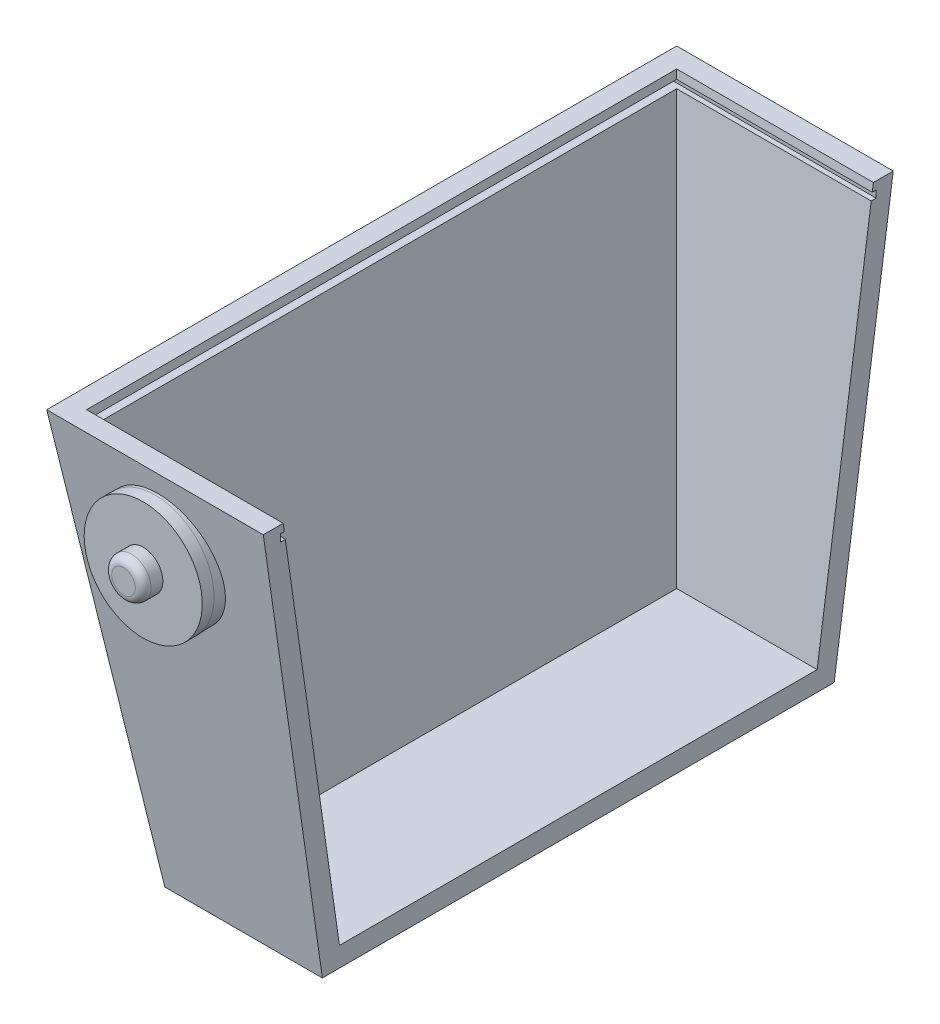
ISO-10303-21;
HEADER;
FILE_DESCRIPTION(('STEP AP214'),'2;1');
FILE_NAME('part.step','',(''),(''),'','','');
FILE_SCHEMA(('AUTOMOTIVE_DESIGN { 1 0 10303 214 1 1 1 1 }'));
ENDSEC;
DATA;
#1=APPLICATION_CONTEXT('core data for automotive mechanical design processes');
#2=APPLICATION_PROTOCOL_DEFINITION('international standard','automotive_design',2000,#1);
#3=PRODUCT_CONTEXT('',#1,'mechanical');
#4=PRODUCT('Part','Part','',(#3));
#5=PRODUCT_RELATED_PRODUCT_CATEGORY('part','',(#4));
#6=PRODUCT_DEFINITION_FORMATION('','',#4);
#7=PRODUCT_DEFINITION_CONTEXT('part definition',#1,'design');
#8=PRODUCT_DEFINITION('design','',#6,#7);
#9=PRODUCT_DEFINITION_SHAPE('','',#8);
#10=(LENGTH_UNIT() NAMED_UNIT(*) SI_UNIT(.MILLI.,.METRE.));
#11=(NAMED_UNIT(*) PLANE_ANGLE_UNIT() SI_UNIT($,.RADIAN.));
#12=(NAMED_UNIT(*) SI_UNIT($,.STERADIAN.) SOLID_ANGLE_UNIT());
#13=UNCERTAINTY_MEASURE_WITH_UNIT(LENGTH_MEASURE(1.E-05),#10,'distance_accuracy_value','');
#14=(GEOMETRIC_REPRESENTATION_CONTEXT(3) GLOBAL_UNCERTAINTY_ASSIGNED_CONTEXT((#13)) GLOBAL_UNIT_ASSIGNED_CONTEXT((#10,
#11,#12)) REPRESENTATION_CONTEXT('',''));
#15=CARTESIAN_POINT('',(0.,0.,0.));
#16=DIRECTION('',(0.,0.,1.));
#17=DIRECTION('',(1.,0.,0.));
#18=AXIS2_PLACEMENT_3D('',#15,#16,#17);
#19=CARTESIAN_POINT('',(0.,0.,0.));
#20=DIRECTION('',(-1.,0.,0.));
#21=DIRECTION('',(0.,0.,1.));
#22=AXIS2_PLACEMENT_3D('',#19,#20,#21);
#23=PLANE('',#22);
#24=DIRECTION('',(0.,0.,-1.));
#25=VECTOR('',#24,1.);
#26=CARTESIAN_POINT('',(0.,261.62,27.0853483984726));
#27=LINE('',#26,#25);
#28=CARTESIAN_POINT('',(0.,261.62,-354.745348398473));
#29=VERTEX_POINT('',#28);
#30=CARTESIAN_POINT('',(0.,261.62,-357.285348398473));
#31=VERTEX_POINT('',#30);
#32=EDGE_CURVE('E188',#29,#31,#27,.T.);
#33=ORIENTED_EDGE('',*,*,#32,.T.);
#34=DIRECTION('',(0.,-1.,0.));
#35=VECTOR('',#34,1.);
#36=CARTESIAN_POINT('',(0.,261.62,-357.285348398473));
#37=LINE('',#36,#35);
#38=CARTESIAN_POINT('',(0.,257.048,-357.285348398473));
#39=VERTEX_POINT('',#38);
#40=EDGE_CURVE('E208',#31,#39,#37,.T.);
#41=ORIENTED_EDGE('',*,*,#40,.T.);
#42=DIRECTION('',(0.,0.,1.));
#43=VECTOR('',#42,1.);
#44=CARTESIAN_POINT('',(0.,257.048,-357.285348398473));
#45=LINE('',#44,#43);
#46=CARTESIAN_POINT('',(0.,257.048,-354.09220554133));
#47=VERTEX_POINT('',#46);
#48=EDGE_CURVE('E213',#39,#47,#45,.T.);
#49=ORIENTED_EDGE('',*,*,#48,.T.);
#50=DIRECTION('',(0.,-0.989949493661166,0.141421356237309));
#51=VECTOR('',#50,1.);
#52=CARTESIAN_POINT('',(0.,12.7,-319.185348398473));
#53=LINE('',#52,#51);
#54=CARTESIAN_POINT('',(0.,12.7,-319.185348398473));
#55=VERTEX_POINT('',#54);
#56=EDGE_CURVE('E348',#47,#55,#53,.T.);
#57=ORIENTED_EDGE('',*,*,#56,.T.);
#58=DIRECTION('',(0.,0.,1.));
#59=VECTOR('',#58,1.);
#60=CARTESIAN_POINT('',(0.,12.7,-11.0146516015273));
#61=LINE('',#60,#59);
#62=CARTESIAN_POINT('',(0.,12.7,-11.0146516015273));
#63=VERTEX_POINT('',#62);
#64=EDGE_CURVE('E254',#55,#63,#61,.T.);
#65=ORIENTED_EDGE('',*,*,#64,.T.);
#66=DIRECTION('',(0.,0.989949493661166,0.141421356237309));
#67=VECTOR('',#66,1.);
#68=CARTESIAN_POINT('',(0.,266.7,25.2710626841869));
#69=LINE('',#68,#67);
#70=CARTESIAN_POINT('',(0.,257.048,23.8922055413297));
#71=VERTEX_POINT('',#70);
#72=EDGE_CURVE('E346',#63,#71,#69,.T.);
#73=ORIENTED_EDGE('',*,*,#72,.T.);
#74=CARTESIAN_POINT('',(0.,257.048,27.0853483984727));
#75=VERTEX_POINT('',#74);
#76=EDGE_CURVE('E211',#71,#75,#45,.T.);
#77=ORIENTED_EDGE('',*,*,#76,.T.);
#78=DIRECTION('',(0.,1.,0.));
#79=VECTOR('',#78,1.);
#80=CARTESIAN_POINT('',(0.,257.048,27.0853483984727));
#81=LINE('',#80,#79);
#82=CARTESIAN_POINT('',(0.,261.62,27.0853483984726));
#83=VERTEX_POINT('',#82);
#84=EDGE_CURVE('E186',#75,#83,#81,.T.);
#85=ORIENTED_EDGE('',*,*,#84,.T.);
#86=CARTESIAN_POINT('',(0.,261.62,24.5453483984727));
#87=VERTEX_POINT('',#86);
#88=EDGE_CURVE('E212',#83,#87,#27,.T.);
#89=ORIENTED_EDGE('',*,*,#88,.T.);
#90=CARTESIAN_POINT('',(0.,266.7,25.2710626841869));
#91=VERTEX_POINT('',#90);
#92=EDGE_CURVE('E64',#87,#91,#69,.T.);
#93=ORIENTED_EDGE('',*,*,#92,.T.);
#94=DIRECTION('',(0.,0.,-1.));
#95=VECTOR('',#94,1.);
#96=CARTESIAN_POINT('',(0.,266.7,-368.3));
#97=LINE('',#96,#95);
#98=CARTESIAN_POINT('',(0.,266.7,38.1));
#99=VERTEX_POINT('',#98);
#100=EDGE_CURVE('E326',#99,#91,#97,.T.);
#101=ORIENTED_EDGE('',*,*,#100,.F.);
#102=DIRECTION('',(0.,0.989949493661166,0.141421356237309));
#103=VECTOR('',#102,1.);
#104=CARTESIAN_POINT('',(0.,0.,0.));
#105=LINE('',#104,#103);
#106=CARTESIAN_POINT('',(0.,0.,0.));
#107=VERTEX_POINT('',#106);
#108=EDGE_CURVE('E497',#107,#99,#105,.T.);
#109=ORIENTED_EDGE('',*,*,#108,.F.);
#110=DIRECTION('',(0.,0.,-1.));
#111=VECTOR('',#110,1.);
#112=CARTESIAN_POINT('',(0.,0.,-330.2));
#113=LINE('',#112,#111);
#114=CARTESIAN_POINT('',(0.,0.,-330.2));
#115=VERTEX_POINT('',#114);
#116=EDGE_CURVE('E479',#107,#115,#113,.T.);
#117=ORIENTED_EDGE('',*,*,#116,.T.);
#118=DIRECTION('',(0.,0.989949493661167,-0.141421356237309));
#119=VECTOR('',#118,1.);
#120=CARTESIAN_POINT('',(0.,0.,-330.2));
#121=LINE('',#120,#119);
#122=CARTESIAN_POINT('',(0.,266.7,-368.3));
#123=VERTEX_POINT('',#122);
#124=EDGE_CURVE('E488',#115,#123,#121,.T.);
#125=ORIENTED_EDGE('',*,*,#124,.T.);
#126=CARTESIAN_POINT('',(0.,266.7,-355.471062684187));
#127=VERTEX_POINT('',#126);
#128=EDGE_CURVE('E343',#127,#123,#97,.T.);
#129=ORIENTED_EDGE('',*,*,#128,.F.);
#130=EDGE_CURVE('E263',#127,#29,#53,.T.);
#131=ORIENTED_EDGE('',*,*,#130,.T.);
#132=EDGE_LOOP('',(#33,#41,#49,#57,#65,#73,#77,#85,#89,#93,#101,#109,#117,#125,#129,#131));
#133=FACE_BOUND('',#132,.T.);
#134=ADVANCED_FACE('F60',(#133),#23,.F.);
#135=CARTESIAN_POINT('',(0.,1.79605122421383,-12.5723585694968));
#136=DIRECTION('',(0.,0.14142135623731,-0.989949493661167));
#137=DIRECTION('',(0.,0.989949493661167,0.14142135623731));
#138=AXIS2_PLACEMENT_3D('',#135,#136,#137);
#139=PLANE('',#138);
#140=ORIENTED_EDGE('',*,*,#92,.F.);
#141=DIRECTION('',(-1.,0.,0.));
#142=VECTOR('',#141,1.);
#143=CARTESIAN_POINT('',(0.,261.62,24.5453483984726));
#144=LINE('',#143,#142);
#145=CARTESIAN_POINT('',(-126.145348398473,261.62,24.5453483984726));
#146=VERTEX_POINT('',#145);
#147=EDGE_CURVE('E230',#87,#146,#144,.T.);
#148=ORIENTED_EDGE('',*,*,#147,.T.);
#149=DIRECTION('',(-0.140028008402802,0.980196058819607,0.140028008402801));
#150=VECTOR('',#149,1.);
#151=CARTESIAN_POINT('',(-87.2820014024541,-10.4234289721298,-14.3179985975459));
#152=LINE('',#151,#150);
#153=CARTESIAN_POINT('',(-126.871062684187,266.7,25.2710626841869));
#154=VERTEX_POINT('',#153);
#155=EDGE_CURVE('E272',#146,#154,#152,.T.);
#156=ORIENTED_EDGE('',*,*,#155,.T.);
#157=DIRECTION('',(1.,0.,0.));
#158=VECTOR('',#157,1.);
#159=CARTESIAN_POINT('',(0.,266.7,25.2710626841869));
#160=LINE('',#159,#158);
#161=EDGE_CURVE('E371',#154,#91,#160,.T.);
#162=ORIENTED_EDGE('',*,*,#161,.T.);
#163=EDGE_LOOP('',(#140,#148,#156,#162));
#164=FACE_BOUND('',#163,.T.);
#165=ADVANCED_FACE('F409',(#164),#139,.T.);
#166=CARTESIAN_POINT('',(-90.5853483984726,12.7,-11.0146516015274));
#167=VERTEX_POINT('',#166);
#168=CARTESIAN_POINT('',(-125.49220554133,257.048,23.8922055413298));
#169=VERTEX_POINT('',#168);
#170=EDGE_CURVE('E268',#167,#169,#152,.T.);
#171=ORIENTED_EDGE('',*,*,#170,.T.);
#172=DIRECTION('',(1.,0.,0.));
#173=VECTOR('',#172,1.);
#174=CARTESIAN_POINT('',(0.,257.048,23.8922055413298));
#175=LINE('',#174,#173);
#176=EDGE_CURVE('E78',#169,#71,#175,.T.);
#177=ORIENTED_EDGE('',*,*,#176,.T.);
#178=ORIENTED_EDGE('',*,*,#72,.F.);
#179=DIRECTION('',(1.,0.,0.));
#180=VECTOR('',#179,1.);
#181=CARTESIAN_POINT('',(0.,12.7,-11.0146516015274));
#182=LINE('',#181,#180);
#183=EDGE_CURVE('E265',#167,#63,#182,.T.);
#184=ORIENTED_EDGE('',*,*,#183,.F.);
#185=EDGE_LOOP('',(#171,#177,#178,#184));
#186=FACE_BOUND('',#185,.T.);
#187=ADVANCED_FACE('F412',(#186),#139,.T.);
#188=CARTESIAN_POINT('',(0.,-44.4319487757861,-311.023641430503));
#189=DIRECTION('',(0.,0.141421356237309,0.989949493661166));
#190=DIRECTION('',(0.,-0.989949493661167,0.141421356237309));
#191=AXIS2_PLACEMENT_3D('',#188,#189,#190);
#192=PLANE('',#191);
#193=DIRECTION('',(-0.140028008402802,0.980196058819607,-0.140028008402801));
#194=VECTOR('',#193,1.);
#195=CARTESIAN_POINT('',(-80.8074915985325,-55.7449975995807,-309.407491598532));
#196=LINE('',#195,#194);
#197=CARTESIAN_POINT('',(-126.145348398473,261.62,-354.745348398473));
#198=VERTEX_POINT('',#197);
#199=CARTESIAN_POINT('',(-126.871062684187,266.7,-355.471062684187));
#200=VERTEX_POINT('',#199);
#201=EDGE_CURVE('E267',#198,#200,#196,.T.);
#202=ORIENTED_EDGE('',*,*,#201,.F.);
#203=DIRECTION('',(1.,0.,0.));
#204=VECTOR('',#203,1.);
#205=CARTESIAN_POINT('',(0.,261.62,-354.745348398473));
#206=LINE('',#205,#204);
#207=EDGE_CURVE('E227',#198,#29,#206,.T.);
#208=ORIENTED_EDGE('',*,*,#207,.T.);
#209=ORIENTED_EDGE('',*,*,#130,.F.);
#210=DIRECTION('',(-1.,0.,0.));
#211=VECTOR('',#210,1.);
#212=CARTESIAN_POINT('',(0.,266.7,-355.471062684187));
#213=LINE('',#212,#211);
#214=EDGE_CURVE('E278',#127,#200,#213,.T.);
#215=ORIENTED_EDGE('',*,*,#214,.T.);
#216=EDGE_LOOP('',(#202,#208,#209,#215));
#217=FACE_BOUND('',#216,.T.);
#218=ADVANCED_FACE('F398',(#217),#192,.T.);
#219=ORIENTED_EDGE('',*,*,#56,.F.);
#220=DIRECTION('',(-1.,0.,0.));
#221=VECTOR('',#220,1.);
#222=CARTESIAN_POINT('',(0.,257.048,-354.09220554133));
#223=LINE('',#222,#221);
#224=CARTESIAN_POINT('',(-125.49220554133,257.048,-354.09220554133));
#225=VERTEX_POINT('',#224);
#226=EDGE_CURVE('E217',#47,#225,#223,.T.);
#227=ORIENTED_EDGE('',*,*,#226,.T.);
#228=CARTESIAN_POINT('',(-90.5853483984726,12.7,-319.185348398473));
#229=VERTEX_POINT('',#228);
#230=EDGE_CURVE('E273',#229,#225,#196,.T.);
#231=ORIENTED_EDGE('',*,*,#230,.F.);
#232=DIRECTION('',(-1.,0.,0.));
#233=VECTOR('',#232,1.);
#234=CARTESIAN_POINT('',(0.,12.7,-319.185348398473));
#235=LINE('',#234,#233);
#236=EDGE_CURVE('E262',#55,#229,#235,.T.);
#237=ORIENTED_EDGE('',*,*,#236,.F.);
#238=EDGE_LOOP('',(#219,#227,#231,#237));
#239=FACE_BOUND('',#238,.T.);
#240=ADVANCED_FACE('F419',(#239),#192,.T.);
#241=CARTESIAN_POINT('',(-86.9956414305031,-12.4279487757862,0.));
#242=DIRECTION('',(0.989949493661166,0.14142135623731,0.));
#243=DIRECTION('',(-0.14142135623731,0.989949493661166,0.));
#244=AXIS2_PLACEMENT_3D('',#241,#242,#243);
#245=PLANE('',#244);
#246=ORIENTED_EDGE('',*,*,#155,.F.);
#247=DIRECTION('',(0.,0.,-1.));
#248=VECTOR('',#247,1.);
#249=CARTESIAN_POINT('',(-126.145348398473,261.62,0.));
#250=LINE('',#249,#248);
#251=EDGE_CURVE('E14',#146,#198,#250,.T.);
#252=ORIENTED_EDGE('',*,*,#251,.T.);
#253=ORIENTED_EDGE('',*,*,#201,.T.);
#254=DIRECTION('',(0.,0.,1.));
#255=VECTOR('',#254,1.);
#256=CARTESIAN_POINT('',(-126.871062684187,266.7,0.));
#257=LINE('',#256,#255);
#258=EDGE_CURVE('E271',#200,#154,#257,.T.);
#259=ORIENTED_EDGE('',*,*,#258,.T.);
#260=EDGE_LOOP('',(#246,#252,#253,#259));
#261=FACE_BOUND('',#260,.T.);
#262=ADVANCED_FACE('F405',(#261),#245,.T.);
#263=ORIENTED_EDGE('',*,*,#230,.T.);
#264=DIRECTION('',(0.,0.,1.));
#265=VECTOR('',#264,1.);
#266=CARTESIAN_POINT('',(-125.49220554133,257.048,0.));
#267=LINE('',#266,#265);
#268=EDGE_CURVE('E70',#225,#169,#267,.T.);
#269=ORIENTED_EDGE('',*,*,#268,.T.);
#270=ORIENTED_EDGE('',*,*,#170,.F.);
#271=DIRECTION('',(0.,0.,1.));
#272=VECTOR('',#271,1.);
#273=CARTESIAN_POINT('',(-90.5853483984726,12.7,0.));
#274=LINE('',#273,#272);
#275=EDGE_CURVE('E259',#229,#167,#274,.T.);
#276=ORIENTED_EDGE('',*,*,#275,.F.);
#277=EDGE_LOOP('',(#263,#269,#270,#276));
#278=FACE_BOUND('',#277,.T.);
#279=ADVANCED_FACE('F416',(#278),#245,.T.);
#280=CARTESIAN_POINT('',(0.,266.7,0.));
#281=DIRECTION('',(0.,-1.,0.));
#282=DIRECTION('',(0.,0.,-1.));
#283=AXIS2_PLACEMENT_3D('',#280,#281,#282);
#284=PLANE('',#283);
#285=ORIENTED_EDGE('',*,*,#214,.F.);
#286=ORIENTED_EDGE('',*,*,#128,.T.);
#287=DIRECTION('',(-1.,0.,0.));
#288=VECTOR('',#287,1.);
#289=CARTESIAN_POINT('',(-139.7,266.7,-368.3));
#290=LINE('',#289,#288);
#291=CARTESIAN_POINT('',(-139.7,266.7,-368.3));
#292=VERTEX_POINT('',#291);
#293=EDGE_CURVE('E86',#123,#292,#290,.T.);
#294=ORIENTED_EDGE('',*,*,#293,.T.);
#295=DIRECTION('',(0.,0.,1.));
#296=VECTOR('',#295,1.);
#297=CARTESIAN_POINT('',(-139.7,266.7,38.1));
#298=LINE('',#297,#296);
#299=CARTESIAN_POINT('',(-139.7,266.7,38.1));
#300=VERTEX_POINT('',#299);
#301=EDGE_CURVE('E495',#292,#300,#298,.T.);
#302=ORIENTED_EDGE('',*,*,#301,.T.);
#303=DIRECTION('',(1.,0.,0.));
#304=VECTOR('',#303,1.);
#305=CARTESIAN_POINT('',(-139.7,266.7,38.1));
#306=LINE('',#305,#304);
#307=EDGE_CURVE('E354',#300,#99,#306,.T.);
#308=ORIENTED_EDGE('',*,*,#307,.T.);
#309=ORIENTED_EDGE('',*,*,#100,.T.);
#310=ORIENTED_EDGE('',*,*,#161,.F.);
#311=ORIENTED_EDGE('',*,*,#258,.F.);
#312=EDGE_LOOP('',(#285,#286,#294,#302,#308,#309,#310,#311));
#313=FACE_BOUND('',#312,.T.);
#314=ADVANCED_FACE('F449',(#313),#284,.F.);
#315=CARTESIAN_POINT('',(0.,0.,0.));
#316=DIRECTION('',(0.,1.,0.));
#317=DIRECTION('',(0.,0.,1.));
#318=AXIS2_PLACEMENT_3D('',#315,#316,#317);
#319=PLANE('',#318);
#320=DIRECTION('',(0.,0.,1.));
#321=VECTOR('',#320,1.);
#322=CARTESIAN_POINT('',(-101.6,0.,0.));
#323=LINE('',#322,#321);
#324=CARTESIAN_POINT('',(-101.6,0.,-330.2));
#325=VERTEX_POINT('',#324);
#326=CARTESIAN_POINT('',(-101.6,0.,0.));
#327=VERTEX_POINT('',#326);
#328=EDGE_CURVE('E376',#325,#327,#323,.T.);
#329=ORIENTED_EDGE('',*,*,#328,.F.);
#330=DIRECTION('',(-1.,0.,0.));
#331=VECTOR('',#330,1.);
#332=CARTESIAN_POINT('',(0.,0.,-330.2));
#333=LINE('',#332,#331);
#334=EDGE_CURVE('E472',#115,#325,#333,.T.);
#335=ORIENTED_EDGE('',*,*,#334,.F.);
#336=ORIENTED_EDGE('',*,*,#116,.F.);
#337=DIRECTION('',(1.,0.,0.));
#338=VECTOR('',#337,1.);
#339=CARTESIAN_POINT('',(0.,0.,0.));
#340=LINE('',#339,#338);
#341=EDGE_CURVE('E284',#327,#107,#340,.T.);
#342=ORIENTED_EDGE('',*,*,#341,.F.);
#343=EDGE_LOOP('',(#329,#335,#336,#342));
#344=FACE_BOUND('',#343,.T.);
#345=ADVANCED_FACE('F303',(#344),#319,.F.);
#346=CARTESIAN_POINT('',(0.,0.,0.));
#347=DIRECTION('',(0.,0.14142135623731,-0.989949493661167));
#348=DIRECTION('',(0.,0.989949493661167,0.14142135623731));
#349=AXIS2_PLACEMENT_3D('',#346,#347,#348);
#350=PLANE('',#349);
#351=CARTESIAN_POINT('',(-69.8500000000001,216.088809201909,30.869829885987));
#352=DIRECTION('',(0.,0.14142135623731,-0.989949493661167));
#353=DIRECTION('',(0.,0.989949493661167,0.14142135623731));
#354=AXIS2_PLACEMENT_3D('',#351,#352,#353);
#355=ELLIPSE('',#354,38.2317654975403,37.8470459386596);
#356=CARTESIAN_POINT('',(-69.8500000000002,253.936326097971,36.2766180139959));
#357=VERTEX_POINT('',#356);
#358=EDGE_CURVE('E379',#357,#357,#355,.F.);
#359=ORIENTED_EDGE('',*,*,#358,.F.);
#360=EDGE_LOOP('',(#359));
#361=FACE_BOUND('',#360,.T.);
#362=ORIENTED_EDGE('',*,*,#108,.T.);
#363=ORIENTED_EDGE('',*,*,#307,.F.);
#364=DIRECTION('',(-0.140028008402802,0.980196058819607,0.140028008402801));
#365=VECTOR('',#364,1.);
#366=CARTESIAN_POINT('',(-101.6,0.,0.));
#367=LINE('',#366,#365);
#368=EDGE_CURVE('E290',#327,#300,#367,.T.);
#369=ORIENTED_EDGE('',*,*,#368,.F.);
#370=ORIENTED_EDGE('',*,*,#341,.T.);
#371=EDGE_LOOP('',(#362,#363,#369,#370));
#372=FACE_BOUND('',#371,.T.);
#373=ADVANCED_FACE('F292',(#361,#372),#350,.F.);
#374=CARTESIAN_POINT('',(0.,-46.228,-323.596));
#375=DIRECTION('',(0.,0.141421356237309,0.989949493661166));
#376=DIRECTION('',(0.,-0.989949493661167,0.141421356237309));
#377=AXIS2_PLACEMENT_3D('',#374,#375,#376);
#378=PLANE('',#377);
#379=CARTESIAN_POINT('',(-69.8500000000001,216.088809201909,-361.069829885987));
#380=DIRECTION('',(0.,0.141421356237309,0.989949493661166));
#381=DIRECTION('',(0.,0.989949493661166,-0.141421356237309));
#382=AXIS2_PLACEMENT_3D('',#379,#380,#381);
#383=ELLIPSE('',#382,38.2317654975403,37.8470459386595);
#384=CARTESIAN_POINT('',(-69.8500000000001,253.936326097971,-366.476618013996));
#385=VERTEX_POINT('',#384);
#386=EDGE_CURVE('E244',#385,#385,#383,.T.);
#387=ORIENTED_EDGE('',*,*,#386,.T.);
#388=EDGE_LOOP('',(#387));
#389=FACE_BOUND('',#388,.T.);
#390=DIRECTION('',(-0.140028008402802,0.980196058819607,-0.140028008402801));
#391=VECTOR('',#390,1.);
#392=CARTESIAN_POINT('',(-101.6,0.,-330.2));
#393=LINE('',#392,#391);
#394=EDGE_CURVE('E493',#325,#292,#393,.T.);
#395=ORIENTED_EDGE('',*,*,#394,.T.);
#396=ORIENTED_EDGE('',*,*,#293,.F.);
#397=ORIENTED_EDGE('',*,*,#124,.F.);
#398=ORIENTED_EDGE('',*,*,#334,.T.);
#399=EDGE_LOOP('',(#395,#396,#397,#398));
#400=FACE_BOUND('',#399,.T.);
#401=ADVANCED_FACE('F302',(#389,#400),#378,.F.);
#402=CARTESIAN_POINT('',(-99.568,-14.2240000000001,0.));
#403=DIRECTION('',(0.989949493661166,0.14142135623731,0.));
#404=DIRECTION('',(-0.14142135623731,0.989949493661166,0.));
#405=AXIS2_PLACEMENT_3D('',#402,#403,#404);
#406=PLANE('',#405);
#407=ORIENTED_EDGE('',*,*,#368,.T.);
#408=ORIENTED_EDGE('',*,*,#301,.F.);
#409=ORIENTED_EDGE('',*,*,#394,.F.);
#410=ORIENTED_EDGE('',*,*,#328,.T.);
#411=EDGE_LOOP('',(#407,#408,#409,#410));
#412=FACE_BOUND('',#411,.T.);
#413=ADVANCED_FACE('F425',(#412),#406,.F.);
#414=CARTESIAN_POINT('',(0.,12.7,0.));
#415=DIRECTION('',(0.,1.,0.));
#416=DIRECTION('',(0.,0.,1.));
#417=AXIS2_PLACEMENT_3D('',#414,#415,#416);
#418=PLANE('',#417);
#419=ORIENTED_EDGE('',*,*,#275,.T.);
#420=ORIENTED_EDGE('',*,*,#183,.T.);
#421=ORIENTED_EDGE('',*,*,#64,.F.);
#422=ORIENTED_EDGE('',*,*,#236,.T.);
#423=EDGE_LOOP('',(#419,#420,#421,#422));
#424=FACE_BOUND('',#423,.T.);
#425=ADVANCED_FACE('F422',(#424),#418,.T.);
#426=CARTESIAN_POINT('',(-69.8500000000001,215.9,45.7200000000001));
#427=DIRECTION('',(0.,0.,-1.));
#428=DIRECTION('',(-1.,0.,0.));
#429=AXIS2_PLACEMENT_3D('',#426,#427,#428);
#430=CYLINDRICAL_SURFACE('',#429,38.1);
#431=CARTESIAN_POINT('',(-69.8500000000001,215.9,45.7200000000001));
#432=DIRECTION('',(0.,0.,-1.));
#433=DIRECTION('',(-1.,0.,0.));
#434=AXIS2_PLACEMENT_3D('',#431,#432,#433);
#435=CIRCLE('',#434,38.1);
#436=CARTESIAN_POINT('',(-107.95,215.9,45.7200000000001));
#437=VERTEX_POINT('',#436);
#438=EDGE_CURVE('E251',#437,#437,#435,.T.);
#439=ORIENTED_EDGE('',*,*,#438,.T.);
#440=EDGE_LOOP('',(#439));
#441=FACE_BOUND('',#440,.T.);
#442=CARTESIAN_POINT('',(-69.8500000000001,215.9,38.1000000000001));
#443=DIRECTION('',(0.,0.,-1.));
#444=DIRECTION('',(-1.,0.,0.));
#445=AXIS2_PLACEMENT_3D('',#442,#443,#444);
#446=CIRCLE('',#445,38.1);
#447=CARTESIAN_POINT('',(-107.95,215.9,38.1000000000001));
#448=VERTEX_POINT('',#447);
#449=EDGE_CURVE('E250',#448,#448,#446,.T.);
#450=ORIENTED_EDGE('',*,*,#449,.F.);
#451=EDGE_LOOP('',(#450));
#452=FACE_BOUND('',#451,.T.);
#453=ADVANCED_FACE('F424',(#441,#452),#430,.T.);
#454=CARTESIAN_POINT('',(-69.8500000000001,215.9,45.7200000000001));
#455=DIRECTION('',(0.,0.,-1.));
#456=DIRECTION('',(-1.,0.,0.));
#457=AXIS2_PLACEMENT_3D('',#454,#455,#456);
#458=PLANE('',#457);
#459=CARTESIAN_POINT('',(-69.8500000000001,215.9,45.7200000000003));
#460=DIRECTION('',(0.,0.,-1.));
#461=DIRECTION('',(-1.,0.,0.));
#462=AXIS2_PLACEMENT_3D('',#459,#460,#461);
#463=CIRCLE('',#462,12.7);
#464=CARTESIAN_POINT('',(-82.5500000000001,215.9,45.7200000000003));
#465=VERTEX_POINT('',#464);
#466=EDGE_CURVE('E247',#465,#465,#463,.T.);
#467=ORIENTED_EDGE('',*,*,#466,.T.);
#468=EDGE_LOOP('',(#467));
#469=FACE_BOUND('',#468,.T.);
#470=ORIENTED_EDGE('',*,*,#438,.F.);
#471=EDGE_LOOP('',(#470));
#472=FACE_BOUND('',#471,.T.);
#473=ADVANCED_FACE('F431',(#469,#472),#458,.F.);
#474=CARTESIAN_POINT('',(-69.8500000000001,215.9,38.1000000000001));
#475=DIRECTION('',(0.,0.,1.));
#476=DIRECTION('',(-1.,0.,0.));
#477=AXIS2_PLACEMENT_3D('',#474,#475,#476);
#478=CONICAL_SURFACE('',#477,38.1,0.0349065850398866);
#479=ORIENTED_EDGE('',*,*,#449,.T.);
#480=EDGE_LOOP('',(#479));
#481=FACE_BOUND('',#480,.T.);
#482=ORIENTED_EDGE('',*,*,#358,.T.);
#483=EDGE_LOOP('',(#482));
#484=FACE_BOUND('',#483,.T.);
#485=ADVANCED_FACE('F576',(#481,#484),#478,.T.);
#486=CARTESIAN_POINT('',(-69.8500000000001,215.9,58.4200000000003));
#487=DIRECTION('',(0.,0.,-1.));
#488=DIRECTION('',(-1.,0.,0.));
#489=AXIS2_PLACEMENT_3D('',#486,#487,#488);
#490=CYLINDRICAL_SURFACE('',#489,12.7);
#491=CARTESIAN_POINT('',(-69.8500000000001,215.9,53.3400000000003));
#492=DIRECTION('',(0.,0.,-1.));
#493=DIRECTION('',(-1.,0.,0.));
#494=AXIS2_PLACEMENT_3D('',#491,#492,#493);
#495=CIRCLE('',#494,12.7);
#496=CARTESIAN_POINT('',(-82.5500000000001,215.9,53.3400000000003));
#497=VERTEX_POINT('',#496);
#498=EDGE_CURVE('E382',#497,#497,#495,.T.);
#499=ORIENTED_EDGE('',*,*,#498,.T.);
#500=EDGE_LOOP('',(#499));
#501=FACE_BOUND('',#500,.T.);
#502=ORIENTED_EDGE('',*,*,#466,.F.);
#503=EDGE_LOOP('',(#502));
#504=FACE_BOUND('',#503,.T.);
#505=ADVANCED_FACE('F567',(#501,#504),#490,.T.);
#506=CARTESIAN_POINT('',(-69.8500000000001,215.9,58.4200000000003));
#507=DIRECTION('',(0.,0.,-1.));
#508=DIRECTION('',(-1.,0.,0.));
#509=AXIS2_PLACEMENT_3D('',#506,#507,#508);
#510=PLANE('',#509);
#511=CARTESIAN_POINT('',(-69.8500000000001,215.9,58.4200000000003));
#512=DIRECTION('',(0.,0.,-1.));
#513=DIRECTION('',(-1.,0.,0.));
#514=AXIS2_PLACEMENT_3D('',#511,#512,#513);
#515=CIRCLE('',#514,7.62);
#516=CARTESIAN_POINT('',(-77.4700000000001,215.9,58.4200000000003));
#517=VERTEX_POINT('',#516);
#518=EDGE_CURVE('E238',#517,#517,#515,.F.);
#519=ORIENTED_EDGE('',*,*,#518,.T.);
#520=EDGE_LOOP('',(#519));
#521=FACE_BOUND('',#520,.T.);
#522=ADVANCED_FACE('F558',(#521),#510,.F.);
#523=CARTESIAN_POINT('',(-69.8500000000001,215.9,53.3400000000003));
#524=DIRECTION('',(0.,0.,-1.));
#525=DIRECTION('',(-1.,0.,0.));
#526=AXIS2_PLACEMENT_3D('',#523,#524,#525);
#527=TOROIDAL_SURFACE('',#526,7.62,5.08);
#528=ORIENTED_EDGE('',*,*,#518,.F.);
#529=EDGE_LOOP('',(#528));
#530=FACE_BOUND('',#529,.T.);
#531=ORIENTED_EDGE('',*,*,#498,.F.);
#532=EDGE_LOOP('',(#531));
#533=FACE_BOUND('',#532,.T.);
#534=ADVANCED_FACE('F545',(#530,#533),#527,.T.);
#535=CARTESIAN_POINT('',(-69.8500000000001,215.9,-368.3));
#536=DIRECTION('',(0.,0.,-1.));
#537=DIRECTION('',(-1.,0.,0.));
#538=AXIS2_PLACEMENT_3D('',#535,#536,#537);
#539=CONICAL_SURFACE('',#538,38.1,0.0349065850398866);
#540=CARTESIAN_POINT('',(-69.8500000000001,215.9,-368.3));
#541=DIRECTION('',(0.,0.,-1.));
#542=DIRECTION('',(-1.,0.,0.));
#543=AXIS2_PLACEMENT_3D('',#540,#541,#542);
#544=CIRCLE('',#543,38.1);
#545=CARTESIAN_POINT('',(-107.95,215.9,-368.3));
#546=VERTEX_POINT('',#545);
#547=EDGE_CURVE('E233',#546,#546,#544,.T.);
#548=ORIENTED_EDGE('',*,*,#547,.F.);
#549=EDGE_LOOP('',(#548));
#550=FACE_BOUND('',#549,.T.);
#551=ORIENTED_EDGE('',*,*,#386,.F.);
#552=EDGE_LOOP('',(#551));
#553=FACE_BOUND('',#552,.T.);
#554=ADVANCED_FACE('F557',(#550,#553),#539,.T.);
#555=CARTESIAN_POINT('',(-69.8500000000001,215.9,-375.92));
#556=DIRECTION('',(0.,0.,1.));
#557=DIRECTION('',(1.,0.,0.));
#558=AXIS2_PLACEMENT_3D('',#555,#556,#557);
#559=CYLINDRICAL_SURFACE('',#558,38.1);
#560=CARTESIAN_POINT('',(-69.8500000000001,215.9,-375.92));
#561=DIRECTION('',(0.,0.,-1.));
#562=DIRECTION('',(-1.,0.,0.));
#563=AXIS2_PLACEMENT_3D('',#560,#561,#562);
#564=CIRCLE('',#563,38.1);
#565=CARTESIAN_POINT('',(-107.95,215.9,-375.92));
#566=VERTEX_POINT('',#565);
#567=EDGE_CURVE('E241',#566,#566,#564,.T.);
#568=ORIENTED_EDGE('',*,*,#567,.F.);
#569=EDGE_LOOP('',(#568));
#570=FACE_BOUND('',#569,.T.);
#571=ORIENTED_EDGE('',*,*,#547,.T.);
#572=EDGE_LOOP('',(#571));
#573=FACE_BOUND('',#572,.T.);
#574=ADVANCED_FACE('F564',(#570,#573),#559,.T.);
#575=CARTESIAN_POINT('',(-69.8500000000001,215.9,-375.92));
#576=DIRECTION('',(0.,0.,1.));
#577=DIRECTION('',(-1.,0.,0.));
#578=AXIS2_PLACEMENT_3D('',#575,#576,#577);
#579=PLANE('',#578);
#580=CARTESIAN_POINT('',(-69.8500000000001,215.9,-375.92));
#581=DIRECTION('',(0.,0.,-1.));
#582=DIRECTION('',(-1.,0.,0.));
#583=AXIS2_PLACEMENT_3D('',#580,#581,#582);
#584=CIRCLE('',#583,12.7);
#585=CARTESIAN_POINT('',(-82.5500000000001,215.9,-375.92));
#586=VERTEX_POINT('',#585);
#587=EDGE_CURVE('E234',#586,#586,#584,.T.);
#588=ORIENTED_EDGE('',*,*,#587,.F.);
#589=EDGE_LOOP('',(#588));
#590=FACE_BOUND('',#589,.T.);
#591=ORIENTED_EDGE('',*,*,#567,.T.);
#592=EDGE_LOOP('',(#591));
#593=FACE_BOUND('',#592,.T.);
#594=ADVANCED_FACE('F596',(#590,#593),#579,.F.);
#595=CARTESIAN_POINT('',(-69.8500000000001,215.9,-388.62));
#596=DIRECTION('',(0.,0.,1.));
#597=DIRECTION('',(1.,0.,0.));
#598=AXIS2_PLACEMENT_3D('',#595,#596,#597);
#599=CYLINDRICAL_SURFACE('',#598,12.7);
#600=CARTESIAN_POINT('',(-69.8500000000001,215.9,-383.54));
#601=DIRECTION('',(0.,0.,1.));
#602=DIRECTION('',(1.,0.,0.));
#603=AXIS2_PLACEMENT_3D('',#600,#601,#602);
#604=CIRCLE('',#603,12.7);
#605=CARTESIAN_POINT('',(-57.1500000000001,215.9,-383.54));
#606=VERTEX_POINT('',#605);
#607=EDGE_CURVE('E389',#606,#606,#604,.T.);
#608=ORIENTED_EDGE('',*,*,#607,.T.);
#609=EDGE_LOOP('',(#608));
#610=FACE_BOUND('',#609,.T.);
#611=ORIENTED_EDGE('',*,*,#587,.T.);
#612=EDGE_LOOP('',(#611));
#613=FACE_BOUND('',#612,.T.);
#614=ADVANCED_FACE('F599',(#610,#613),#599,.T.);
#615=CARTESIAN_POINT('',(-69.8500000000001,215.9,-388.62));
#616=DIRECTION('',(0.,0.,1.));
#617=DIRECTION('',(-1.,0.,0.));
#618=AXIS2_PLACEMENT_3D('',#615,#616,#617);
#619=PLANE('',#618);
#620=CARTESIAN_POINT('',(-69.8500000000001,215.9,-388.62));
#621=DIRECTION('',(0.,0.,1.));
#622=DIRECTION('',(1.,0.,0.));
#623=AXIS2_PLACEMENT_3D('',#620,#621,#622);
#624=CIRCLE('',#623,7.62);
#625=CARTESIAN_POINT('',(-62.2300000000001,215.9,-388.62));
#626=VERTEX_POINT('',#625);
#627=EDGE_CURVE('E237',#626,#626,#624,.F.);
#628=ORIENTED_EDGE('',*,*,#627,.T.);
#629=EDGE_LOOP('',(#628));
#630=FACE_BOUND('',#629,.T.);
#631=ADVANCED_FACE('F604',(#630),#619,.F.);
#632=CARTESIAN_POINT('',(-69.8500000000001,215.9,-383.54));
#633=DIRECTION('',(0.,0.,1.));
#634=DIRECTION('',(1.,0.,0.));
#635=AXIS2_PLACEMENT_3D('',#632,#633,#634);
#636=TOROIDAL_SURFACE('',#635,7.62,5.08);
#637=ORIENTED_EDGE('',*,*,#607,.F.);
#638=EDGE_LOOP('',(#637));
#639=FACE_BOUND('',#638,.T.);
#640=ORIENTED_EDGE('',*,*,#627,.F.);
#641=EDGE_LOOP('',(#640));
#642=FACE_BOUND('',#641,.T.);
#643=ADVANCED_FACE('F62',(#639,#642),#636,.T.);
#644=CARTESIAN_POINT('',(384.39788727329,261.62,27.0853483984726));
#645=DIRECTION('',(0.,-1.,0.));
#646=DIRECTION('',(0.,0.,-1.));
#647=AXIS2_PLACEMENT_3D('',#644,#645,#646);
#648=PLANE('',#647);
#649=ORIENTED_EDGE('',*,*,#88,.F.);
#650=DIRECTION('',(-1.,0.,0.));
#651=VECTOR('',#650,1.);
#652=CARTESIAN_POINT('',(384.39788727329,261.62,27.0853483984726));
#653=LINE('',#652,#651);
#654=CARTESIAN_POINT('',(-131.951062684187,261.62,27.0853483984726));
#655=VERTEX_POINT('',#654);
#656=EDGE_CURVE('E207',#83,#655,#653,.T.);
#657=ORIENTED_EDGE('',*,*,#656,.T.);
#658=DIRECTION('',(0.,0.,1.));
#659=VECTOR('',#658,1.);
#660=CARTESIAN_POINT('',(-131.951062684187,261.62,27.0853483984726));
#661=LINE('',#660,#659);
#662=CARTESIAN_POINT('',(-131.951062684187,261.62,-357.285348398473));
#663=VERTEX_POINT('',#662);
#664=EDGE_CURVE('E202',#663,#655,#661,.T.);
#665=ORIENTED_EDGE('',*,*,#664,.F.);
#666=DIRECTION('',(-1.,0.,0.));
#667=VECTOR('',#666,1.);
#668=CARTESIAN_POINT('',(384.39788727329,261.62,-357.285348398473));
#669=LINE('',#668,#667);
#670=EDGE_CURVE('E219',#31,#663,#669,.T.);
#671=ORIENTED_EDGE('',*,*,#670,.F.);
#672=ORIENTED_EDGE('',*,*,#32,.F.);
#673=ORIENTED_EDGE('',*,*,#207,.F.);
#674=ORIENTED_EDGE('',*,*,#251,.F.);
#675=ORIENTED_EDGE('',*,*,#147,.F.);
#676=EDGE_LOOP('',(#649,#657,#665,#671,#672,#673,#674,#675));
#677=FACE_BOUND('',#676,.T.);
#678=ADVANCED_FACE('F401',(#677),#648,.T.);
#679=CARTESIAN_POINT('',(384.39788727329,261.62,-357.285348398473));
#680=DIRECTION('',(0.,0.,1.));
#681=DIRECTION('',(1.,0.,0.));
#682=AXIS2_PLACEMENT_3D('',#679,#680,#681);
#683=PLANE('',#682);
#684=ORIENTED_EDGE('',*,*,#670,.T.);
#685=DIRECTION('',(0.,1.,0.));
#686=VECTOR('',#685,1.);
#687=CARTESIAN_POINT('',(-131.951062684187,261.62,-357.285348398473));
#688=LINE('',#687,#686);
#689=CARTESIAN_POINT('',(-131.951062684187,257.048,-357.285348398473));
#690=VERTEX_POINT('',#689);
#691=EDGE_CURVE('E198',#690,#663,#688,.T.);
#692=ORIENTED_EDGE('',*,*,#691,.F.);
#693=DIRECTION('',(-1.,0.,0.));
#694=VECTOR('',#693,1.);
#695=CARTESIAN_POINT('',(384.39788727329,257.048,-357.285348398473));
#696=LINE('',#695,#694);
#697=EDGE_CURVE('E189',#39,#690,#696,.T.);
#698=ORIENTED_EDGE('',*,*,#697,.F.);
#699=ORIENTED_EDGE('',*,*,#40,.F.);
#700=EDGE_LOOP('',(#684,#692,#698,#699));
#701=FACE_BOUND('',#700,.T.);
#702=ADVANCED_FACE('F613',(#701),#683,.T.);
#703=CARTESIAN_POINT('',(384.39788727329,257.048,-357.285348398473));
#704=DIRECTION('',(0.,1.,0.));
#705=DIRECTION('',(0.,0.,1.));
#706=AXIS2_PLACEMENT_3D('',#703,#704,#705);
#707=PLANE('',#706);
#708=ORIENTED_EDGE('',*,*,#268,.F.);
#709=ORIENTED_EDGE('',*,*,#226,.F.);
#710=ORIENTED_EDGE('',*,*,#48,.F.);
#711=ORIENTED_EDGE('',*,*,#697,.T.);
#712=DIRECTION('',(0.,0.,-1.));
#713=VECTOR('',#712,1.);
#714=CARTESIAN_POINT('',(-131.951062684187,257.048,-357.285348398473));
#715=LINE('',#714,#713);
#716=CARTESIAN_POINT('',(-131.951062684187,257.048,27.0853483984727));
#717=VERTEX_POINT('',#716);
#718=EDGE_CURVE('E192',#717,#690,#715,.T.);
#719=ORIENTED_EDGE('',*,*,#718,.F.);
#720=DIRECTION('',(-1.,0.,0.));
#721=VECTOR('',#720,1.);
#722=CARTESIAN_POINT('',(384.39788727329,257.048,27.0853483984727));
#723=LINE('',#722,#721);
#724=EDGE_CURVE('E178',#75,#717,#723,.T.);
#725=ORIENTED_EDGE('',*,*,#724,.F.);
#726=ORIENTED_EDGE('',*,*,#76,.F.);
#727=ORIENTED_EDGE('',*,*,#176,.F.);
#728=EDGE_LOOP('',(#708,#709,#710,#711,#719,#725,#726,#727));
#729=FACE_BOUND('',#728,.T.);
#730=ADVANCED_FACE('F193',(#729),#707,.T.);
#731=CARTESIAN_POINT('',(384.39788727329,257.048,27.0853483984727));
#732=DIRECTION('',(0.,0.,-1.));
#733=DIRECTION('',(0.,1.,0.));
#734=AXIS2_PLACEMENT_3D('',#731,#732,#733);
#735=PLANE('',#734);
#736=ORIENTED_EDGE('',*,*,#724,.T.);
#737=DIRECTION('',(0.,-1.,0.));
#738=VECTOR('',#737,1.);
#739=CARTESIAN_POINT('',(-131.951062684187,257.048,27.0853483984727));
#740=LINE('',#739,#738);
#741=EDGE_CURVE('E183',#655,#717,#740,.T.);
#742=ORIENTED_EDGE('',*,*,#741,.F.);
#743=ORIENTED_EDGE('',*,*,#656,.F.);
#744=ORIENTED_EDGE('',*,*,#84,.F.);
#745=EDGE_LOOP('',(#736,#742,#743,#744));
#746=FACE_BOUND('',#745,.T.);
#747=ADVANCED_FACE('F180',(#746),#735,.T.);
#748=CARTESIAN_POINT('',(-131.951062684187,0.,0.));
#749=DIRECTION('',(-1.,0.,0.));
#750=DIRECTION('',(0.,0.,1.));
#751=AXIS2_PLACEMENT_3D('',#748,#749,#750);
#752=PLANE('',#751);
#753=ORIENTED_EDGE('',*,*,#741,.T.);
#754=ORIENTED_EDGE('',*,*,#718,.T.);
#755=ORIENTED_EDGE('',*,*,#691,.T.);
#756=ORIENTED_EDGE('',*,*,#664,.T.);
#757=EDGE_LOOP('',(#753,#754,#755,#756));
#758=FACE_BOUND('',#757,.T.);
#759=ADVANCED_FACE('F200',(#758),#752,.F.);
#760=CLOSED_SHELL('',(#134,#165,#187,#218,#240,#262,#279,#314,#345,#373,#401,#413,#425,#453,
#473,#485,#505,#522,#534,#554,#574,#594,#614,#631,#643,#678,#702,#730,#747,#759));
#761=MANIFOLD_SOLID_BREP('B2',#760);
#762=ADVANCED_BREP_SHAPE_REPRESENTATION('',(#18,#761),#14);
#763=SHAPE_DEFINITION_REPRESENTATION(#9,#762);
ENDSEC;
END-ISO-10303-21;
